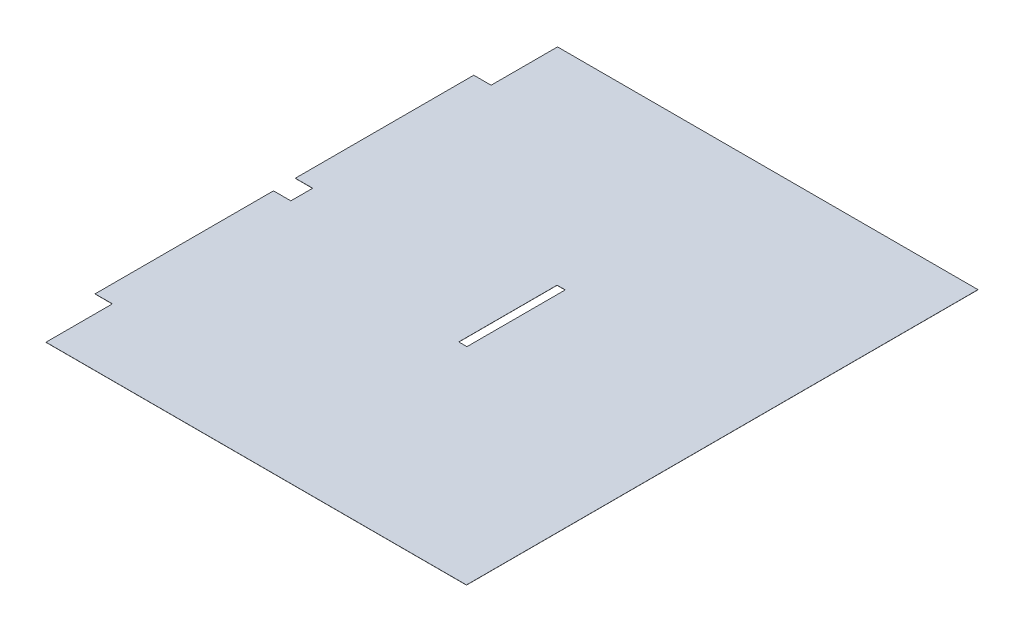
ISO-10303-21;
HEADER;
FILE_DESCRIPTION(('STEP AP214'),'2;1');
FILE_NAME('part.step','',(''),(''),'','','');
FILE_SCHEMA(('AUTOMOTIVE_DESIGN { 1 0 10303 214 1 1 1 1 }'));
ENDSEC;
DATA;
#1=APPLICATION_CONTEXT('core data for automotive mechanical design processes');
#2=APPLICATION_PROTOCOL_DEFINITION('international standard','automotive_design',2000,#1);
#3=PRODUCT_CONTEXT('',#1,'mechanical');
#4=PRODUCT('Part','Part','',(#3));
#5=PRODUCT_RELATED_PRODUCT_CATEGORY('part','',(#4));
#6=PRODUCT_DEFINITION_FORMATION('','',#4);
#7=PRODUCT_DEFINITION_CONTEXT('part definition',#1,'design');
#8=PRODUCT_DEFINITION('design','',#6,#7);
#9=PRODUCT_DEFINITION_SHAPE('','',#8);
#10=(LENGTH_UNIT() NAMED_UNIT(*) SI_UNIT(.MILLI.,.METRE.));
#11=(NAMED_UNIT(*) PLANE_ANGLE_UNIT() SI_UNIT($,.RADIAN.));
#12=(NAMED_UNIT(*) SI_UNIT($,.STERADIAN.) SOLID_ANGLE_UNIT());
#13=UNCERTAINTY_MEASURE_WITH_UNIT(LENGTH_MEASURE(1.E-05),#10,'distance_accuracy_value','');
#14=(GEOMETRIC_REPRESENTATION_CONTEXT(3) GLOBAL_UNCERTAINTY_ASSIGNED_CONTEXT((#13)) GLOBAL_UNIT_ASSIGNED_CONTEXT((#10,
#11,#12)) REPRESENTATION_CONTEXT('',''));
#15=CARTESIAN_POINT('',(0.,0.,0.));
#16=DIRECTION('',(0.,0.,1.));
#17=DIRECTION('',(1.,0.,0.));
#18=AXIS2_PLACEMENT_3D('',#15,#16,#17);
#19=CARTESIAN_POINT('',(0.,61.4032,0.));
#20=DIRECTION('',(0.,1.,0.));
#21=DIRECTION('',(0.,0.,1.));
#22=AXIS2_PLACEMENT_3D('',#19,#20,#21);
#23=PLANE('',#22);
#24=DIRECTION('',(0.,0.,-1.));
#25=VECTOR('',#24,1.);
#26=CARTESIAN_POINT('',(115.475,61.4032,-140.475));
#27=LINE('',#26,#25);
#28=CARTESIAN_POINT('',(115.475,61.4032,140.475));
#29=VERTEX_POINT('',#28);
#30=CARTESIAN_POINT('',(115.475,61.4032,-140.475));
#31=VERTEX_POINT('',#30);
#32=EDGE_CURVE('E188',#29,#31,#27,.T.);
#33=ORIENTED_EDGE('',*,*,#32,.T.);
#34=DIRECTION('',(-1.,0.,0.));
#35=VECTOR('',#34,1.);
#36=CARTESIAN_POINT('',(-115.475,61.4032,-140.475));
#37=LINE('',#36,#35);
#38=CARTESIAN_POINT('',(-115.475,61.4032,-140.475));
#39=VERTEX_POINT('',#38);
#40=EDGE_CURVE('E191',#31,#39,#37,.T.);
#41=ORIENTED_EDGE('',*,*,#40,.T.);
#42=DIRECTION('',(0.,0.,1.));
#43=VECTOR('',#42,1.);
#44=CARTESIAN_POINT('',(-115.475,61.4032,-104.));
#45=LINE('',#44,#43);
#46=CARTESIAN_POINT('',(-115.475,61.4032,-104.));
#47=VERTEX_POINT('',#46);
#48=EDGE_CURVE('E194',#39,#47,#45,.T.);
#49=ORIENTED_EDGE('',*,*,#48,.T.);
#50=DIRECTION('',(-1.,0.,0.));
#51=VECTOR('',#50,1.);
#52=CARTESIAN_POINT('',(-125.,61.4032,-104.));
#53=LINE('',#52,#51);
#54=CARTESIAN_POINT('',(-125.,61.4032,-104.));
#55=VERTEX_POINT('',#54);
#56=EDGE_CURVE('E196',#47,#55,#53,.T.);
#57=ORIENTED_EDGE('',*,*,#56,.T.);
#58=DIRECTION('',(0.,0.,1.));
#59=VECTOR('',#58,1.);
#60=CARTESIAN_POINT('',(-125.,61.4032,-104.));
#61=LINE('',#60,#59);
#62=CARTESIAN_POINT('',(-125.,61.4032,-5.99999999999994));
#63=VERTEX_POINT('',#62);
#64=EDGE_CURVE('E198',#55,#63,#61,.T.);
#65=ORIENTED_EDGE('',*,*,#64,.T.);
#66=DIRECTION('',(1.,0.,0.));
#67=VECTOR('',#66,1.);
#68=CARTESIAN_POINT('',(-125.,61.4032,-5.99999999999994));
#69=LINE('',#68,#67);
#70=CARTESIAN_POINT('',(-115.475,61.4032,-5.99999999999994));
#71=VERTEX_POINT('',#70);
#72=EDGE_CURVE('E200',#63,#71,#69,.T.);
#73=ORIENTED_EDGE('',*,*,#72,.T.);
#74=DIRECTION('',(0.,0.,1.));
#75=VECTOR('',#74,1.);
#76=CARTESIAN_POINT('',(-115.475,61.4032,-5.99999999999994));
#77=LINE('',#76,#75);
#78=CARTESIAN_POINT('',(-115.475,61.4032,6.00000000000006));
#79=VERTEX_POINT('',#78);
#80=EDGE_CURVE('E202',#71,#79,#77,.T.);
#81=ORIENTED_EDGE('',*,*,#80,.T.);
#82=DIRECTION('',(-1.,0.,0.));
#83=VECTOR('',#82,1.);
#84=CARTESIAN_POINT('',(-125.,61.4032,6.00000000000006));
#85=LINE('',#84,#83);
#86=CARTESIAN_POINT('',(-125.,61.4032,6.00000000000006));
#87=VERTEX_POINT('',#86);
#88=EDGE_CURVE('E204',#79,#87,#85,.T.);
#89=ORIENTED_EDGE('',*,*,#88,.T.);
#90=DIRECTION('',(0.,0.,1.));
#91=VECTOR('',#90,1.);
#92=CARTESIAN_POINT('',(-125.,61.4032,6.00000000000006));
#93=LINE('',#92,#91);
#94=CARTESIAN_POINT('',(-125.,61.4032,104.));
#95=VERTEX_POINT('',#94);
#96=EDGE_CURVE('E206',#87,#95,#93,.T.);
#97=ORIENTED_EDGE('',*,*,#96,.T.);
#98=DIRECTION('',(1.,0.,0.));
#99=VECTOR('',#98,1.);
#100=CARTESIAN_POINT('',(-125.,61.4032,104.));
#101=LINE('',#100,#99);
#102=CARTESIAN_POINT('',(-115.475,61.4032,104.));
#103=VERTEX_POINT('',#102);
#104=EDGE_CURVE('E208',#95,#103,#101,.T.);
#105=ORIENTED_EDGE('',*,*,#104,.T.);
#106=DIRECTION('',(0.,0.,1.));
#107=VECTOR('',#106,1.);
#108=CARTESIAN_POINT('',(-115.475,61.4032,104.));
#109=LINE('',#108,#107);
#110=CARTESIAN_POINT('',(-115.475,61.4032,140.475));
#111=VERTEX_POINT('',#110);
#112=EDGE_CURVE('E210',#103,#111,#109,.T.);
#113=ORIENTED_EDGE('',*,*,#112,.T.);
#114=DIRECTION('',(1.,0.,0.));
#115=VECTOR('',#114,1.);
#116=CARTESIAN_POINT('',(-115.475,61.4032,140.475));
#117=LINE('',#116,#115);
#118=EDGE_CURVE('E212',#111,#29,#117,.T.);
#119=ORIENTED_EDGE('',*,*,#118,.T.);
#120=EDGE_LOOP('',(#33,#41,#49,#57,#65,#73,#81,#89,#97,#105,#113,#119));
#121=FACE_BOUND('',#120,.T.);
#122=DIRECTION('',(-1.,0.,0.));
#123=VECTOR('',#122,1.);
#124=CARTESIAN_POINT('',(-2.25,61.4032,-27.));
#125=LINE('',#124,#123);
#126=CARTESIAN_POINT('',(2.25,61.4032,-27.));
#127=VERTEX_POINT('',#126);
#128=CARTESIAN_POINT('',(-2.25,61.4032,-27.));
#129=VERTEX_POINT('',#128);
#130=EDGE_CURVE('E160',#127,#129,#125,.T.);
#131=ORIENTED_EDGE('',*,*,#130,.F.);
#132=DIRECTION('',(0.,0.,-1.));
#133=VECTOR('',#132,1.);
#134=CARTESIAN_POINT('',(2.25,61.4032,-27.));
#135=LINE('',#134,#133);
#136=CARTESIAN_POINT('',(2.25,61.4032,27.));
#137=VERTEX_POINT('',#136);
#138=EDGE_CURVE('E152',#137,#127,#135,.T.);
#139=ORIENTED_EDGE('',*,*,#138,.F.);
#140=DIRECTION('',(1.,0.,0.));
#141=VECTOR('',#140,1.);
#142=CARTESIAN_POINT('',(-2.25,61.4032,27.));
#143=LINE('',#142,#141);
#144=CARTESIAN_POINT('',(-2.25,61.4032,27.));
#145=VERTEX_POINT('',#144);
#146=EDGE_CURVE('E174',#145,#137,#143,.T.);
#147=ORIENTED_EDGE('',*,*,#146,.F.);
#148=DIRECTION('',(0.,0.,1.));
#149=VECTOR('',#148,1.);
#150=CARTESIAN_POINT('',(-2.25,61.4032,-27.));
#151=LINE('',#150,#149);
#152=EDGE_CURVE('E172',#129,#145,#151,.T.);
#153=ORIENTED_EDGE('',*,*,#152,.F.);
#154=EDGE_LOOP('',(#131,#139,#147,#153));
#155=FACE_BOUND('',#154,.T.);
#156=ADVANCED_FACE('F39',(#121,#155),#23,.T.);
#157=CARTESIAN_POINT('',(0.,61.327,0.));
#158=DIRECTION('',(0.,1.,0.));
#159=DIRECTION('',(0.,0.,1.));
#160=AXIS2_PLACEMENT_3D('',#157,#158,#159);
#161=PLANE('',#160);
#162=DIRECTION('',(0.,0.,-1.));
#163=VECTOR('',#162,1.);
#164=CARTESIAN_POINT('',(115.475,61.327,-140.475));
#165=LINE('',#164,#163);
#166=CARTESIAN_POINT('',(115.475,61.327,140.475));
#167=VERTEX_POINT('',#166);
#168=CARTESIAN_POINT('',(115.475,61.327,-140.475));
#169=VERTEX_POINT('',#168);
#170=EDGE_CURVE('E168',#167,#169,#165,.T.);
#171=ORIENTED_EDGE('',*,*,#170,.F.);
#172=DIRECTION('',(1.,0.,0.));
#173=VECTOR('',#172,1.);
#174=CARTESIAN_POINT('',(-115.475,61.327,140.475));
#175=LINE('',#174,#173);
#176=CARTESIAN_POINT('',(-115.475,61.327,140.475));
#177=VERTEX_POINT('',#176);
#178=EDGE_CURVE('E192',#177,#167,#175,.T.);
#179=ORIENTED_EDGE('',*,*,#178,.F.);
#180=DIRECTION('',(0.,0.,1.));
#181=VECTOR('',#180,1.);
#182=CARTESIAN_POINT('',(-115.475,61.327,104.));
#183=LINE('',#182,#181);
#184=CARTESIAN_POINT('',(-115.475,61.327,104.));
#185=VERTEX_POINT('',#184);
#186=EDGE_CURVE('E235',#185,#177,#183,.T.);
#187=ORIENTED_EDGE('',*,*,#186,.F.);
#188=DIRECTION('',(1.,0.,0.));
#189=VECTOR('',#188,1.);
#190=CARTESIAN_POINT('',(-125.,61.327,104.));
#191=LINE('',#190,#189);
#192=CARTESIAN_POINT('',(-125.,61.327,104.));
#193=VERTEX_POINT('',#192);
#194=EDGE_CURVE('E233',#193,#185,#191,.T.);
#195=ORIENTED_EDGE('',*,*,#194,.F.);
#196=DIRECTION('',(0.,0.,1.));
#197=VECTOR('',#196,1.);
#198=CARTESIAN_POINT('',(-125.,61.327,6.00000000000006));
#199=LINE('',#198,#197);
#200=CARTESIAN_POINT('',(-125.,61.327,6.00000000000006));
#201=VERTEX_POINT('',#200);
#202=EDGE_CURVE('E231',#201,#193,#199,.T.);
#203=ORIENTED_EDGE('',*,*,#202,.F.);
#204=DIRECTION('',(-1.,0.,0.));
#205=VECTOR('',#204,1.);
#206=CARTESIAN_POINT('',(-125.,61.327,6.00000000000006));
#207=LINE('',#206,#205);
#208=CARTESIAN_POINT('',(-115.475,61.327,6.00000000000006));
#209=VERTEX_POINT('',#208);
#210=EDGE_CURVE('E229',#209,#201,#207,.T.);
#211=ORIENTED_EDGE('',*,*,#210,.F.);
#212=DIRECTION('',(0.,0.,1.));
#213=VECTOR('',#212,1.);
#214=CARTESIAN_POINT('',(-115.475,61.327,-5.99999999999994));
#215=LINE('',#214,#213);
#216=CARTESIAN_POINT('',(-115.475,61.327,-5.99999999999994));
#217=VERTEX_POINT('',#216);
#218=EDGE_CURVE('E227',#217,#209,#215,.T.);
#219=ORIENTED_EDGE('',*,*,#218,.F.);
#220=DIRECTION('',(1.,0.,0.));
#221=VECTOR('',#220,1.);
#222=CARTESIAN_POINT('',(-125.,61.327,-5.99999999999994));
#223=LINE('',#222,#221);
#224=CARTESIAN_POINT('',(-125.,61.327,-5.99999999999994));
#225=VERTEX_POINT('',#224);
#226=EDGE_CURVE('E225',#225,#217,#223,.T.);
#227=ORIENTED_EDGE('',*,*,#226,.F.);
#228=DIRECTION('',(0.,0.,1.));
#229=VECTOR('',#228,1.);
#230=CARTESIAN_POINT('',(-125.,61.327,-104.));
#231=LINE('',#230,#229);
#232=CARTESIAN_POINT('',(-125.,61.327,-104.));
#233=VERTEX_POINT('',#232);
#234=EDGE_CURVE('E223',#233,#225,#231,.T.);
#235=ORIENTED_EDGE('',*,*,#234,.F.);
#236=DIRECTION('',(-1.,0.,0.));
#237=VECTOR('',#236,1.);
#238=CARTESIAN_POINT('',(-125.,61.327,-104.));
#239=LINE('',#238,#237);
#240=CARTESIAN_POINT('',(-115.475,61.327,-104.));
#241=VERTEX_POINT('',#240);
#242=EDGE_CURVE('E221',#241,#233,#239,.T.);
#243=ORIENTED_EDGE('',*,*,#242,.F.);
#244=DIRECTION('',(0.,0.,1.));
#245=VECTOR('',#244,1.);
#246=CARTESIAN_POINT('',(-115.475,61.327,-104.));
#247=LINE('',#246,#245);
#248=CARTESIAN_POINT('',(-115.475,61.327,-140.475));
#249=VERTEX_POINT('',#248);
#250=EDGE_CURVE('E219',#249,#241,#247,.T.);
#251=ORIENTED_EDGE('',*,*,#250,.F.);
#252=DIRECTION('',(-1.,0.,0.));
#253=VECTOR('',#252,1.);
#254=CARTESIAN_POINT('',(-115.475,61.327,-140.475));
#255=LINE('',#254,#253);
#256=EDGE_CURVE('E217',#169,#249,#255,.T.);
#257=ORIENTED_EDGE('',*,*,#256,.F.);
#258=EDGE_LOOP('',(#171,#179,#187,#195,#203,#211,#219,#227,#235,#243,#251,#257));
#259=FACE_BOUND('',#258,.T.);
#260=DIRECTION('',(0.,0.,-1.));
#261=VECTOR('',#260,1.);
#262=CARTESIAN_POINT('',(2.25,61.327,-27.));
#263=LINE('',#262,#261);
#264=CARTESIAN_POINT('',(2.25,61.327,27.));
#265=VERTEX_POINT('',#264);
#266=CARTESIAN_POINT('',(2.25,61.327,-27.));
#267=VERTEX_POINT('',#266);
#268=EDGE_CURVE('E62',#265,#267,#263,.T.);
#269=ORIENTED_EDGE('',*,*,#268,.T.);
#270=DIRECTION('',(-1.,0.,0.));
#271=VECTOR('',#270,1.);
#272=CARTESIAN_POINT('',(-2.25,61.327,-27.));
#273=LINE('',#272,#271);
#274=CARTESIAN_POINT('',(-2.25,61.327,-27.));
#275=VERTEX_POINT('',#274);
#276=EDGE_CURVE('E167',#267,#275,#273,.T.);
#277=ORIENTED_EDGE('',*,*,#276,.T.);
#278=DIRECTION('',(0.,0.,1.));
#279=VECTOR('',#278,1.);
#280=CARTESIAN_POINT('',(-2.25,61.327,-27.));
#281=LINE('',#280,#279);
#282=CARTESIAN_POINT('',(-2.25,61.327,27.));
#283=VERTEX_POINT('',#282);
#284=EDGE_CURVE('E180',#275,#283,#281,.T.);
#285=ORIENTED_EDGE('',*,*,#284,.T.);
#286=DIRECTION('',(1.,0.,0.));
#287=VECTOR('',#286,1.);
#288=CARTESIAN_POINT('',(-2.25,61.327,27.));
#289=LINE('',#288,#287);
#290=EDGE_CURVE('E161',#283,#265,#289,.T.);
#291=ORIENTED_EDGE('',*,*,#290,.T.);
#292=EDGE_LOOP('',(#269,#277,#285,#291));
#293=FACE_BOUND('',#292,.T.);
#294=ADVANCED_FACE('F277',(#259,#293),#161,.F.);
#295=CARTESIAN_POINT('',(115.475,61.4032,-140.475));
#296=DIRECTION('',(-1.,0.,0.));
#297=DIRECTION('',(0.,0.,1.));
#298=AXIS2_PLACEMENT_3D('',#295,#296,#297);
#299=PLANE('',#298);
#300=ORIENTED_EDGE('',*,*,#170,.T.);
#301=DIRECTION('',(0.,-1.,0.));
#302=VECTOR('',#301,1.);
#303=CARTESIAN_POINT('',(115.475,61.4032,-140.475));
#304=LINE('',#303,#302);
#305=EDGE_CURVE('E11',#31,#169,#304,.T.);
#306=ORIENTED_EDGE('',*,*,#305,.F.);
#307=ORIENTED_EDGE('',*,*,#32,.F.);
#308=DIRECTION('',(0.,-1.,0.));
#309=VECTOR('',#308,1.);
#310=CARTESIAN_POINT('',(115.475,61.4032,140.475));
#311=LINE('',#310,#309);
#312=EDGE_CURVE('E214',#29,#167,#311,.T.);
#313=ORIENTED_EDGE('',*,*,#312,.T.);
#314=EDGE_LOOP('',(#300,#306,#307,#313));
#315=FACE_BOUND('',#314,.T.);
#316=ADVANCED_FACE('F41',(#315),#299,.F.);
#317=CARTESIAN_POINT('',(-115.475,61.4032,-140.475));
#318=DIRECTION('',(0.,0.,1.));
#319=DIRECTION('',(1.,0.,0.));
#320=AXIS2_PLACEMENT_3D('',#317,#318,#319);
#321=PLANE('',#320);
#322=ORIENTED_EDGE('',*,*,#256,.T.);
#323=DIRECTION('',(0.,-1.,0.));
#324=VECTOR('',#323,1.);
#325=CARTESIAN_POINT('',(-115.475,61.4032,-140.475));
#326=LINE('',#325,#324);
#327=EDGE_CURVE('E47',#39,#249,#326,.T.);
#328=ORIENTED_EDGE('',*,*,#327,.F.);
#329=ORIENTED_EDGE('',*,*,#40,.F.);
#330=ORIENTED_EDGE('',*,*,#305,.T.);
#331=EDGE_LOOP('',(#322,#328,#329,#330));
#332=FACE_BOUND('',#331,.T.);
#333=ADVANCED_FACE('F294',(#332),#321,.F.);
#334=CARTESIAN_POINT('',(-115.475,61.4032,-104.));
#335=DIRECTION('',(1.,0.,0.));
#336=DIRECTION('',(0.,0.,-1.));
#337=AXIS2_PLACEMENT_3D('',#334,#335,#336);
#338=PLANE('',#337);
#339=ORIENTED_EDGE('',*,*,#250,.T.);
#340=DIRECTION('',(0.,-1.,0.));
#341=VECTOR('',#340,1.);
#342=CARTESIAN_POINT('',(-115.475,61.4032,-104.));
#343=LINE('',#342,#341);
#344=EDGE_CURVE('E264',#47,#241,#343,.T.);
#345=ORIENTED_EDGE('',*,*,#344,.F.);
#346=ORIENTED_EDGE('',*,*,#48,.F.);
#347=ORIENTED_EDGE('',*,*,#327,.T.);
#348=EDGE_LOOP('',(#339,#345,#346,#347));
#349=FACE_BOUND('',#348,.T.);
#350=ADVANCED_FACE('F271',(#349),#338,.F.);
#351=CARTESIAN_POINT('',(-125.,61.4032,-104.));
#352=DIRECTION('',(0.,0.,1.));
#353=DIRECTION('',(1.,0.,0.));
#354=AXIS2_PLACEMENT_3D('',#351,#352,#353);
#355=PLANE('',#354);
#356=ORIENTED_EDGE('',*,*,#242,.T.);
#357=DIRECTION('',(0.,-1.,0.));
#358=VECTOR('',#357,1.);
#359=CARTESIAN_POINT('',(-125.,61.4032,-104.));
#360=LINE('',#359,#358);
#361=EDGE_CURVE('E261',#55,#233,#360,.T.);
#362=ORIENTED_EDGE('',*,*,#361,.F.);
#363=ORIENTED_EDGE('',*,*,#56,.F.);
#364=ORIENTED_EDGE('',*,*,#344,.T.);
#365=EDGE_LOOP('',(#356,#362,#363,#364));
#366=FACE_BOUND('',#365,.T.);
#367=ADVANCED_FACE('F283',(#366),#355,.F.);
#368=CARTESIAN_POINT('',(-125.,61.4032,-104.));
#369=DIRECTION('',(1.,0.,0.));
#370=DIRECTION('',(0.,0.,-1.));
#371=AXIS2_PLACEMENT_3D('',#368,#369,#370);
#372=PLANE('',#371);
#373=ORIENTED_EDGE('',*,*,#234,.T.);
#374=DIRECTION('',(0.,-1.,0.));
#375=VECTOR('',#374,1.);
#376=CARTESIAN_POINT('',(-125.,61.4032,-5.99999999999994));
#377=LINE('',#376,#375);
#378=EDGE_CURVE('E258',#63,#225,#377,.T.);
#379=ORIENTED_EDGE('',*,*,#378,.F.);
#380=ORIENTED_EDGE('',*,*,#64,.F.);
#381=ORIENTED_EDGE('',*,*,#361,.T.);
#382=EDGE_LOOP('',(#373,#379,#380,#381));
#383=FACE_BOUND('',#382,.T.);
#384=ADVANCED_FACE('F287',(#383),#372,.F.);
#385=CARTESIAN_POINT('',(-125.,61.4032,-5.99999999999994));
#386=DIRECTION('',(0.,0.,-1.));
#387=DIRECTION('',(-1.,0.,0.));
#388=AXIS2_PLACEMENT_3D('',#385,#386,#387);
#389=PLANE('',#388);
#390=ORIENTED_EDGE('',*,*,#226,.T.);
#391=DIRECTION('',(0.,-1.,0.));
#392=VECTOR('',#391,1.);
#393=CARTESIAN_POINT('',(-115.475,61.4032,-5.99999999999994));
#394=LINE('',#393,#392);
#395=EDGE_CURVE('E255',#71,#217,#394,.T.);
#396=ORIENTED_EDGE('',*,*,#395,.F.);
#397=ORIENTED_EDGE('',*,*,#72,.F.);
#398=ORIENTED_EDGE('',*,*,#378,.T.);
#399=EDGE_LOOP('',(#390,#396,#397,#398));
#400=FACE_BOUND('',#399,.T.);
#401=ADVANCED_FACE('F327',(#400),#389,.F.);
#402=CARTESIAN_POINT('',(-115.475,61.4032,-5.99999999999994));
#403=DIRECTION('',(1.,0.,0.));
#404=DIRECTION('',(0.,0.,-1.));
#405=AXIS2_PLACEMENT_3D('',#402,#403,#404);
#406=PLANE('',#405);
#407=ORIENTED_EDGE('',*,*,#218,.T.);
#408=DIRECTION('',(0.,-1.,0.));
#409=VECTOR('',#408,1.);
#410=CARTESIAN_POINT('',(-115.475,61.4032,6.00000000000006));
#411=LINE('',#410,#409);
#412=EDGE_CURVE('E252',#79,#209,#411,.T.);
#413=ORIENTED_EDGE('',*,*,#412,.F.);
#414=ORIENTED_EDGE('',*,*,#80,.F.);
#415=ORIENTED_EDGE('',*,*,#395,.T.);
#416=EDGE_LOOP('',(#407,#413,#414,#415));
#417=FACE_BOUND('',#416,.T.);
#418=ADVANCED_FACE('F325',(#417),#406,.F.);
#419=CARTESIAN_POINT('',(-125.,61.4032,6.00000000000006));
#420=DIRECTION('',(0.,0.,1.));
#421=DIRECTION('',(1.,0.,0.));
#422=AXIS2_PLACEMENT_3D('',#419,#420,#421);
#423=PLANE('',#422);
#424=ORIENTED_EDGE('',*,*,#210,.T.);
#425=DIRECTION('',(0.,-1.,0.));
#426=VECTOR('',#425,1.);
#427=CARTESIAN_POINT('',(-125.,61.4032,6.00000000000006));
#428=LINE('',#427,#426);
#429=EDGE_CURVE('E249',#87,#201,#428,.T.);
#430=ORIENTED_EDGE('',*,*,#429,.F.);
#431=ORIENTED_EDGE('',*,*,#88,.F.);
#432=ORIENTED_EDGE('',*,*,#412,.T.);
#433=EDGE_LOOP('',(#424,#430,#431,#432));
#434=FACE_BOUND('',#433,.T.);
#435=ADVANCED_FACE('F321',(#434),#423,.F.);
#436=CARTESIAN_POINT('',(-125.,61.4032,6.00000000000006));
#437=DIRECTION('',(1.,0.,0.));
#438=DIRECTION('',(0.,0.,-1.));
#439=AXIS2_PLACEMENT_3D('',#436,#437,#438);
#440=PLANE('',#439);
#441=ORIENTED_EDGE('',*,*,#202,.T.);
#442=DIRECTION('',(0.,-1.,0.));
#443=VECTOR('',#442,1.);
#444=CARTESIAN_POINT('',(-125.,61.4032,104.));
#445=LINE('',#444,#443);
#446=EDGE_CURVE('E246',#95,#193,#445,.T.);
#447=ORIENTED_EDGE('',*,*,#446,.F.);
#448=ORIENTED_EDGE('',*,*,#96,.F.);
#449=ORIENTED_EDGE('',*,*,#429,.T.);
#450=EDGE_LOOP('',(#441,#447,#448,#449));
#451=FACE_BOUND('',#450,.T.);
#452=ADVANCED_FACE('F316',(#451),#440,.F.);
#453=CARTESIAN_POINT('',(-125.,61.4032,104.));
#454=DIRECTION('',(0.,0.,-1.));
#455=DIRECTION('',(-1.,0.,0.));
#456=AXIS2_PLACEMENT_3D('',#453,#454,#455);
#457=PLANE('',#456);
#458=ORIENTED_EDGE('',*,*,#194,.T.);
#459=DIRECTION('',(0.,-1.,0.));
#460=VECTOR('',#459,1.);
#461=CARTESIAN_POINT('',(-115.475,61.4032,104.));
#462=LINE('',#461,#460);
#463=EDGE_CURVE('E243',#103,#185,#462,.T.);
#464=ORIENTED_EDGE('',*,*,#463,.F.);
#465=ORIENTED_EDGE('',*,*,#104,.F.);
#466=ORIENTED_EDGE('',*,*,#446,.T.);
#467=EDGE_LOOP('',(#458,#464,#465,#466));
#468=FACE_BOUND('',#467,.T.);
#469=ADVANCED_FACE('F310',(#468),#457,.F.);
#470=CARTESIAN_POINT('',(-115.475,61.4032,104.));
#471=DIRECTION('',(1.,0.,0.));
#472=DIRECTION('',(0.,0.,-1.));
#473=AXIS2_PLACEMENT_3D('',#470,#471,#472);
#474=PLANE('',#473);
#475=ORIENTED_EDGE('',*,*,#186,.T.);
#476=DIRECTION('',(0.,-1.,0.));
#477=VECTOR('',#476,1.);
#478=CARTESIAN_POINT('',(-115.475,61.4032,140.475));
#479=LINE('',#478,#477);
#480=EDGE_CURVE('E240',#111,#177,#479,.T.);
#481=ORIENTED_EDGE('',*,*,#480,.F.);
#482=ORIENTED_EDGE('',*,*,#112,.F.);
#483=ORIENTED_EDGE('',*,*,#463,.T.);
#484=EDGE_LOOP('',(#475,#481,#482,#483));
#485=FACE_BOUND('',#484,.T.);
#486=ADVANCED_FACE('F306',(#485),#474,.F.);
#487=CARTESIAN_POINT('',(-115.475,61.4032,140.475));
#488=DIRECTION('',(0.,0.,-1.));
#489=DIRECTION('',(-1.,0.,0.));
#490=AXIS2_PLACEMENT_3D('',#487,#488,#489);
#491=PLANE('',#490);
#492=ORIENTED_EDGE('',*,*,#178,.T.);
#493=ORIENTED_EDGE('',*,*,#312,.F.);
#494=ORIENTED_EDGE('',*,*,#118,.F.);
#495=ORIENTED_EDGE('',*,*,#480,.T.);
#496=EDGE_LOOP('',(#492,#493,#494,#495));
#497=FACE_BOUND('',#496,.T.);
#498=ADVANCED_FACE('F301',(#497),#491,.F.);
#499=CARTESIAN_POINT('',(2.25,61.4032,-27.));
#500=DIRECTION('',(-1.,0.,0.));
#501=DIRECTION('',(0.,0.,1.));
#502=AXIS2_PLACEMENT_3D('',#499,#500,#501);
#503=PLANE('',#502);
#504=ORIENTED_EDGE('',*,*,#268,.F.);
#505=DIRECTION('',(0.,-1.,0.));
#506=VECTOR('',#505,1.);
#507=CARTESIAN_POINT('',(2.25,61.4032,27.));
#508=LINE('',#507,#506);
#509=EDGE_CURVE('E156',#137,#265,#508,.T.);
#510=ORIENTED_EDGE('',*,*,#509,.F.);
#511=ORIENTED_EDGE('',*,*,#138,.T.);
#512=DIRECTION('',(0.,-1.,0.));
#513=VECTOR('',#512,1.);
#514=CARTESIAN_POINT('',(2.25,61.4032,-27.));
#515=LINE('',#514,#513);
#516=EDGE_CURVE('E155',#127,#267,#515,.T.);
#517=ORIENTED_EDGE('',*,*,#516,.T.);
#518=EDGE_LOOP('',(#504,#510,#511,#517));
#519=FACE_BOUND('',#518,.T.);
#520=ADVANCED_FACE('F154',(#519),#503,.T.);
#521=CARTESIAN_POINT('',(-2.25,61.4032,-27.));
#522=DIRECTION('',(0.,0.,1.));
#523=DIRECTION('',(1.,0.,0.));
#524=AXIS2_PLACEMENT_3D('',#521,#522,#523);
#525=PLANE('',#524);
#526=ORIENTED_EDGE('',*,*,#276,.F.);
#527=ORIENTED_EDGE('',*,*,#516,.F.);
#528=ORIENTED_EDGE('',*,*,#130,.T.);
#529=DIRECTION('',(0.,-1.,0.));
#530=VECTOR('',#529,1.);
#531=CARTESIAN_POINT('',(-2.25,61.4032,-27.));
#532=LINE('',#531,#530);
#533=EDGE_CURVE('E169',#129,#275,#532,.T.);
#534=ORIENTED_EDGE('',*,*,#533,.T.);
#535=EDGE_LOOP('',(#526,#527,#528,#534));
#536=FACE_BOUND('',#535,.T.);
#537=ADVANCED_FACE('F164',(#536),#525,.T.);
#538=CARTESIAN_POINT('',(-2.25,61.4032,-27.));
#539=DIRECTION('',(1.,0.,0.));
#540=DIRECTION('',(0.,0.,-1.));
#541=AXIS2_PLACEMENT_3D('',#538,#539,#540);
#542=PLANE('',#541);
#543=ORIENTED_EDGE('',*,*,#284,.F.);
#544=ORIENTED_EDGE('',*,*,#533,.F.);
#545=ORIENTED_EDGE('',*,*,#152,.T.);
#546=DIRECTION('',(0.,-1.,0.));
#547=VECTOR('',#546,1.);
#548=CARTESIAN_POINT('',(-2.25,61.4032,27.));
#549=LINE('',#548,#547);
#550=EDGE_CURVE('E54',#145,#283,#549,.T.);
#551=ORIENTED_EDGE('',*,*,#550,.T.);
#552=EDGE_LOOP('',(#543,#544,#545,#551));
#553=FACE_BOUND('',#552,.T.);
#554=ADVANCED_FACE('F391',(#553),#542,.T.);
#555=CARTESIAN_POINT('',(-2.25,61.4032,27.));
#556=DIRECTION('',(0.,0.,-1.));
#557=DIRECTION('',(-1.,0.,0.));
#558=AXIS2_PLACEMENT_3D('',#555,#556,#557);
#559=PLANE('',#558);
#560=ORIENTED_EDGE('',*,*,#290,.F.);
#561=ORIENTED_EDGE('',*,*,#550,.F.);
#562=ORIENTED_EDGE('',*,*,#146,.T.);
#563=ORIENTED_EDGE('',*,*,#509,.T.);
#564=EDGE_LOOP('',(#560,#561,#562,#563));
#565=FACE_BOUND('',#564,.T.);
#566=ADVANCED_FACE('F398',(#565),#559,.T.);
#567=CLOSED_SHELL('',(#156,#294,#316,#333,#350,#367,#384,#401,#418,#435,#452,#469,#486,#498,
#520,#537,#554,#566));
#568=MANIFOLD_SOLID_BREP('B2',#567);
#569=ADVANCED_BREP_SHAPE_REPRESENTATION('',(#18,#568),#14);
#570=SHAPE_DEFINITION_REPRESENTATION(#9,#569);
ENDSEC;
END-ISO-10303-21;
